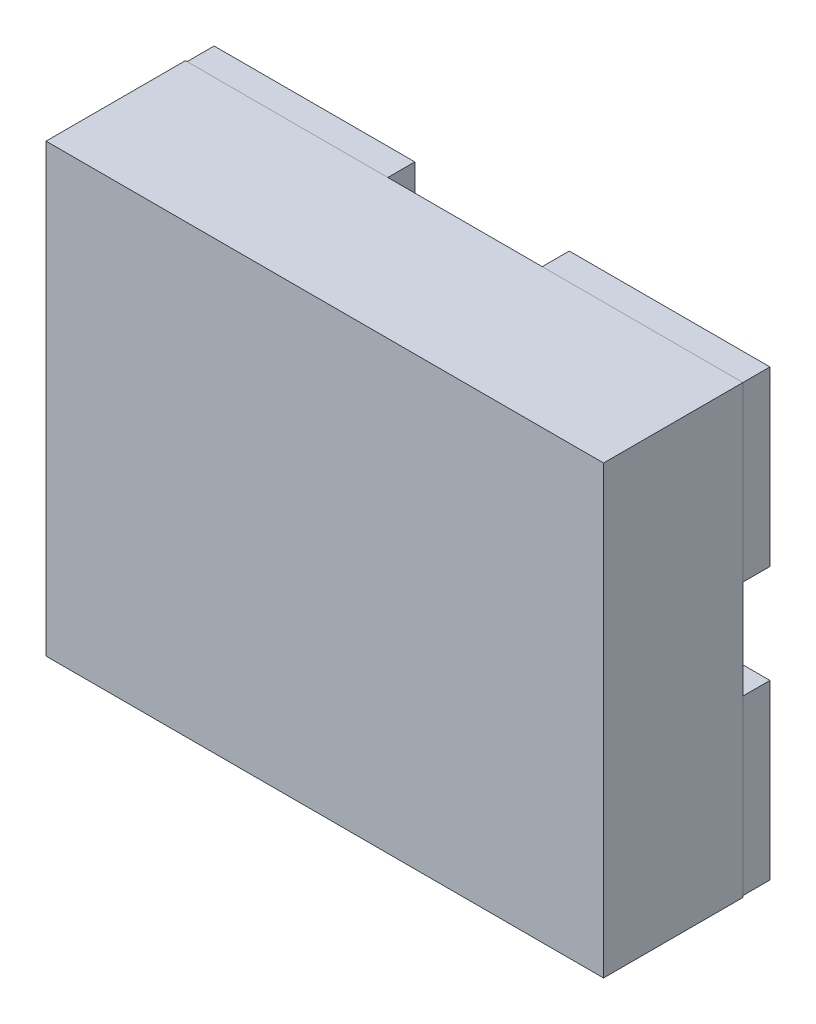
ISO-10303-21;
HEADER;
FILE_DESCRIPTION(('STEP AP214'),'2;1');
FILE_NAME('part.step','',(''),(''),'','','');
FILE_SCHEMA(('AUTOMOTIVE_DESIGN { 1 0 10303 214 1 1 1 1 }'));
ENDSEC;
DATA;
#1=APPLICATION_CONTEXT('core data for automotive mechanical design processes');
#2=APPLICATION_PROTOCOL_DEFINITION('international standard','automotive_design',2000,#1);
#3=PRODUCT_CONTEXT('',#1,'mechanical');
#4=PRODUCT('Part','Part','',(#3));
#5=PRODUCT_RELATED_PRODUCT_CATEGORY('part','',(#4));
#6=PRODUCT_DEFINITION_FORMATION('','',#4);
#7=PRODUCT_DEFINITION_CONTEXT('part definition',#1,'design');
#8=PRODUCT_DEFINITION('design','',#6,#7);
#9=PRODUCT_DEFINITION_SHAPE('','',#8);
#10=(LENGTH_UNIT() NAMED_UNIT(*) SI_UNIT(.MILLI.,.METRE.));
#11=(NAMED_UNIT(*) PLANE_ANGLE_UNIT() SI_UNIT($,.RADIAN.));
#12=(NAMED_UNIT(*) SI_UNIT($,.STERADIAN.) SOLID_ANGLE_UNIT());
#13=UNCERTAINTY_MEASURE_WITH_UNIT(LENGTH_MEASURE(1.E-05),#10,'distance_accuracy_value','');
#14=(GEOMETRIC_REPRESENTATION_CONTEXT(3) GLOBAL_UNCERTAINTY_ASSIGNED_CONTEXT((#13)) GLOBAL_UNIT_ASSIGNED_CONTEXT((#10,
#11,#12)) REPRESENTATION_CONTEXT('',''));
#15=CARTESIAN_POINT('',(0.,0.,0.));
#16=DIRECTION('',(0.,0.,1.));
#17=DIRECTION('',(1.,0.,0.));
#18=AXIS2_PLACEMENT_3D('',#15,#16,#17);
#19=CARTESIAN_POINT('',(0.,0.,0.6));
#20=DIRECTION('',(0.,0.,-1.));
#21=DIRECTION('',(0.,-1.,0.));
#22=AXIS2_PLACEMENT_3D('',#19,#20,#21);
#23=PLANE('',#22);
#24=DIRECTION('',(0.,1.,0.));
#25=VECTOR('',#24,1.);
#26=CARTESIAN_POINT('',(-1.,-0.8,0.6));
#27=LINE('',#26,#25);
#28=CARTESIAN_POINT('',(-1.,-0.8,0.6));
#29=VERTEX_POINT('',#28);
#30=CARTESIAN_POINT('',(-1.,0.8,0.6));
#31=VERTEX_POINT('',#30);
#32=EDGE_CURVE('P0_E21',#29,#31,#27,.T.);
#33=ORIENTED_EDGE('',*,*,#32,.F.);
#34=DIRECTION('',(-1.,0.,0.));
#35=VECTOR('',#34,1.);
#36=CARTESIAN_POINT('',(1.,-0.8,0.6));
#37=LINE('',#36,#35);
#38=CARTESIAN_POINT('',(1.,-0.8,0.6));
#39=VERTEX_POINT('',#38);
#40=EDGE_CURVE('P0_E110',#39,#29,#37,.T.);
#41=ORIENTED_EDGE('',*,*,#40,.F.);
#42=DIRECTION('',(0.,-1.,0.));
#43=VECTOR('',#42,1.);
#44=CARTESIAN_POINT('',(1.,0.8,0.6));
#45=LINE('',#44,#43);
#46=CARTESIAN_POINT('',(1.,0.8,0.6));
#47=VERTEX_POINT('',#46);
#48=EDGE_CURVE('P0_E79',#47,#39,#45,.T.);
#49=ORIENTED_EDGE('',*,*,#48,.F.);
#50=DIRECTION('',(1.,0.,0.));
#51=VECTOR('',#50,1.);
#52=CARTESIAN_POINT('',(-1.,0.8,0.6));
#53=LINE('',#52,#51);
#54=EDGE_CURVE('P0_E77',#31,#47,#53,.T.);
#55=ORIENTED_EDGE('',*,*,#54,.F.);
#56=EDGE_LOOP('',(#33,#41,#49,#55));
#57=FACE_BOUND('',#56,.T.);
#58=ADVANCED_FACE('P0_F17',(#57),#23,.F.);
#59=CARTESIAN_POINT('',(0.,0.,0.1));
#60=DIRECTION('',(0.,0.,-1.));
#61=DIRECTION('',(0.,-1.,0.));
#62=AXIS2_PLACEMENT_3D('',#59,#60,#61);
#63=PLANE('',#62);
#64=DIRECTION('',(1.,0.,0.));
#65=VECTOR('',#64,1.);
#66=CARTESIAN_POINT('',(-1.,0.8,0.1));
#67=LINE('',#66,#65);
#68=CARTESIAN_POINT('',(-1.,0.8,0.1));
#69=VERTEX_POINT('',#68);
#70=CARTESIAN_POINT('',(1.,0.8,0.1));
#71=VERTEX_POINT('',#70);
#72=EDGE_CURVE('P0_E89',#69,#71,#67,.T.);
#73=ORIENTED_EDGE('',*,*,#72,.T.);
#74=DIRECTION('',(0.,-1.,0.));
#75=VECTOR('',#74,1.);
#76=CARTESIAN_POINT('',(1.,0.8,0.1));
#77=LINE('',#76,#75);
#78=CARTESIAN_POINT('',(1.,-0.8,0.1));
#79=VERTEX_POINT('',#78);
#80=EDGE_CURVE('P0_E99',#71,#79,#77,.T.);
#81=ORIENTED_EDGE('',*,*,#80,.T.);
#82=DIRECTION('',(-1.,0.,0.));
#83=VECTOR('',#82,1.);
#84=CARTESIAN_POINT('',(1.,-0.8,0.1));
#85=LINE('',#84,#83);
#86=CARTESIAN_POINT('',(-1.,-0.8,0.1));
#87=VERTEX_POINT('',#86);
#88=EDGE_CURVE('P0_E75',#79,#87,#85,.T.);
#89=ORIENTED_EDGE('',*,*,#88,.T.);
#90=DIRECTION('',(0.,1.,0.));
#91=VECTOR('',#90,1.);
#92=CARTESIAN_POINT('',(-1.,-0.8,0.1));
#93=LINE('',#92,#91);
#94=EDGE_CURVE('P0_E11',#87,#69,#93,.T.);
#95=ORIENTED_EDGE('',*,*,#94,.T.);
#96=EDGE_LOOP('',(#73,#81,#89,#95));
#97=FACE_BOUND('',#96,.T.);
#98=ADVANCED_FACE('P0_F19',(#97),#63,.T.);
#99=CARTESIAN_POINT('',(-1.,-0.8,0.1));
#100=DIRECTION('',(-1.,0.,0.));
#101=DIRECTION('',(0.,0.,1.));
#102=AXIS2_PLACEMENT_3D('',#99,#100,#101);
#103=PLANE('',#102);
#104=DIRECTION('',(0.,0.,1.));
#105=VECTOR('',#104,1.);
#106=CARTESIAN_POINT('',(-1.,-0.8,0.1));
#107=LINE('',#106,#105);
#108=EDGE_CURVE('P0_E72',#87,#29,#107,.T.);
#109=ORIENTED_EDGE('',*,*,#108,.T.);
#110=ORIENTED_EDGE('',*,*,#32,.T.);
#111=DIRECTION('',(0.,0.,1.));
#112=VECTOR('',#111,1.);
#113=CARTESIAN_POINT('',(-1.,0.8,0.1));
#114=LINE('',#113,#112);
#115=EDGE_CURVE('P0_E70',#69,#31,#114,.T.);
#116=ORIENTED_EDGE('',*,*,#115,.F.);
#117=ORIENTED_EDGE('',*,*,#94,.F.);
#118=EDGE_LOOP('',(#109,#110,#116,#117));
#119=FACE_BOUND('',#118,.T.);
#120=ADVANCED_FACE('P0_F68',(#119),#103,.T.);
#121=CARTESIAN_POINT('',(1.,-0.8,0.1));
#122=DIRECTION('',(0.,-1.,0.));
#123=DIRECTION('',(0.,0.,-1.));
#124=AXIS2_PLACEMENT_3D('',#121,#122,#123);
#125=PLANE('',#124);
#126=DIRECTION('',(0.,0.,1.));
#127=VECTOR('',#126,1.);
#128=CARTESIAN_POINT('',(1.,-0.8,0.1));
#129=LINE('',#128,#127);
#130=EDGE_CURVE('P0_E96',#79,#39,#129,.T.);
#131=ORIENTED_EDGE('',*,*,#130,.T.);
#132=ORIENTED_EDGE('',*,*,#40,.T.);
#133=ORIENTED_EDGE('',*,*,#108,.F.);
#134=ORIENTED_EDGE('',*,*,#88,.F.);
#135=EDGE_LOOP('',(#131,#132,#133,#134));
#136=FACE_BOUND('',#135,.T.);
#137=ADVANCED_FACE('P0_F174',(#136),#125,.T.);
#138=CARTESIAN_POINT('',(1.,0.8,0.1));
#139=DIRECTION('',(1.,0.,0.));
#140=DIRECTION('',(0.,1.,0.));
#141=AXIS2_PLACEMENT_3D('',#138,#139,#140);
#142=PLANE('',#141);
#143=DIRECTION('',(0.,0.,1.));
#144=VECTOR('',#143,1.);
#145=CARTESIAN_POINT('',(1.,0.8,0.1));
#146=LINE('',#145,#144);
#147=EDGE_CURVE('P0_E84',#71,#47,#146,.T.);
#148=ORIENTED_EDGE('',*,*,#147,.T.);
#149=ORIENTED_EDGE('',*,*,#48,.T.);
#150=ORIENTED_EDGE('',*,*,#130,.F.);
#151=ORIENTED_EDGE('',*,*,#80,.F.);
#152=EDGE_LOOP('',(#148,#149,#150,#151));
#153=FACE_BOUND('',#152,.T.);
#154=ADVANCED_FACE('P0_F168',(#153),#142,.T.);
#155=CARTESIAN_POINT('',(-1.,0.8,0.1));
#156=DIRECTION('',(0.,1.,0.));
#157=DIRECTION('',(1.,0.,0.));
#158=AXIS2_PLACEMENT_3D('',#155,#156,#157);
#159=PLANE('',#158);
#160=ORIENTED_EDGE('',*,*,#115,.T.);
#161=ORIENTED_EDGE('',*,*,#54,.T.);
#162=ORIENTED_EDGE('',*,*,#147,.F.);
#163=ORIENTED_EDGE('',*,*,#72,.F.);
#164=EDGE_LOOP('',(#160,#161,#162,#163));
#165=FACE_BOUND('',#164,.T.);
#166=ADVANCED_FACE('P0_F87',(#165),#159,.T.);
#167=CLOSED_SHELL('',(#58,#98,#120,#137,#154,#166));
#168=MANIFOLD_SOLID_BREP('P0_B1',#167);
#169=CARTESIAN_POINT('',(-0.997,-0.797,0.1));
#170=DIRECTION('',(0.,0.,1.));
#171=DIRECTION('',(1.,0.,0.));
#172=AXIS2_PLACEMENT_3D('',#169,#170,#171);
#173=PLANE('',#172);
#174=DIRECTION('',(0.,1.,0.));
#175=VECTOR('',#174,1.);
#176=CARTESIAN_POINT('',(-0.997,-0.797,0.1));
#177=LINE('',#176,#175);
#178=CARTESIAN_POINT('',(-0.997,-0.797,0.1));
#179=VERTEX_POINT('',#178);
#180=CARTESIAN_POINT('',(-0.997,-0.177,0.1));
#181=VERTEX_POINT('',#180);
#182=EDGE_CURVE('P1_E72',#179,#181,#177,.T.);
#183=ORIENTED_EDGE('',*,*,#182,.F.);
#184=DIRECTION('',(1.,0.,0.));
#185=VECTOR('',#184,1.);
#186=CARTESIAN_POINT('',(-0.997,-0.797,0.1));
#187=LINE('',#186,#185);
#188=CARTESIAN_POINT('',(-0.277,-0.797,0.1));
#189=VERTEX_POINT('',#188);
#190=EDGE_CURVE('P1_E109',#179,#189,#187,.T.);
#191=ORIENTED_EDGE('',*,*,#190,.T.);
#192=DIRECTION('',(0.,1.,0.));
#193=VECTOR('',#192,1.);
#194=CARTESIAN_POINT('',(-0.277,-0.797,0.1));
#195=LINE('',#194,#193);
#196=CARTESIAN_POINT('',(-0.277,-0.177,0.1));
#197=VERTEX_POINT('',#196);
#198=EDGE_CURVE('P1_E74',#189,#197,#195,.T.);
#199=ORIENTED_EDGE('',*,*,#198,.T.);
#200=DIRECTION('',(1.,0.,0.));
#201=VECTOR('',#200,1.);
#202=CARTESIAN_POINT('',(-0.997,-0.177,0.1));
#203=LINE('',#202,#201);
#204=EDGE_CURVE('P1_E11',#181,#197,#203,.T.);
#205=ORIENTED_EDGE('',*,*,#204,.F.);
#206=EDGE_LOOP('',(#183,#191,#199,#205));
#207=FACE_BOUND('',#206,.T.);
#208=ADVANCED_FACE('P1_F17',(#207),#173,.T.);
#209=CARTESIAN_POINT('',(-0.997,-0.797,0.));
#210=DIRECTION('',(0.,0.,1.));
#211=DIRECTION('',(1.,0.,0.));
#212=AXIS2_PLACEMENT_3D('',#209,#210,#211);
#213=PLANE('',#212);
#214=DIRECTION('',(1.,0.,0.));
#215=VECTOR('',#214,1.);
#216=CARTESIAN_POINT('',(-0.997,-0.177,0.));
#217=LINE('',#216,#215);
#218=CARTESIAN_POINT('',(-0.997,-0.177,0.));
#219=VERTEX_POINT('',#218);
#220=CARTESIAN_POINT('',(-0.277,-0.177,0.));
#221=VERTEX_POINT('',#220);
#222=EDGE_CURVE('P1_E26',#219,#221,#217,.T.);
#223=ORIENTED_EDGE('',*,*,#222,.T.);
#224=DIRECTION('',(0.,1.,0.));
#225=VECTOR('',#224,1.);
#226=CARTESIAN_POINT('',(-0.277,-0.797,0.));
#227=LINE('',#226,#225);
#228=CARTESIAN_POINT('',(-0.277,-0.797,0.));
#229=VERTEX_POINT('',#228);
#230=EDGE_CURVE('P1_E103',#229,#221,#227,.T.);
#231=ORIENTED_EDGE('',*,*,#230,.F.);
#232=DIRECTION('',(1.,0.,0.));
#233=VECTOR('',#232,1.);
#234=CARTESIAN_POINT('',(-0.997,-0.797,0.));
#235=LINE('',#234,#233);
#236=CARTESIAN_POINT('',(-0.997,-0.797,0.));
#237=VERTEX_POINT('',#236);
#238=EDGE_CURVE('P1_E20',#237,#229,#235,.T.);
#239=ORIENTED_EDGE('',*,*,#238,.F.);
#240=DIRECTION('',(0.,1.,0.));
#241=VECTOR('',#240,1.);
#242=CARTESIAN_POINT('',(-0.997,-0.797,0.));
#243=LINE('',#242,#241);
#244=EDGE_CURVE('P1_E82',#237,#219,#243,.T.);
#245=ORIENTED_EDGE('',*,*,#244,.T.);
#246=EDGE_LOOP('',(#223,#231,#239,#245));
#247=FACE_BOUND('',#246,.T.);
#248=ADVANCED_FACE('P1_F118',(#247),#213,.F.);
#249=CARTESIAN_POINT('',(-0.997,-0.177,0.));
#250=DIRECTION('',(0.,1.,0.));
#251=DIRECTION('',(1.,0.,0.));
#252=AXIS2_PLACEMENT_3D('',#249,#250,#251);
#253=PLANE('',#252);
#254=ORIENTED_EDGE('',*,*,#222,.F.);
#255=DIRECTION('',(0.,0.,1.));
#256=VECTOR('',#255,1.);
#257=CARTESIAN_POINT('',(-0.997,-0.177,0.));
#258=LINE('',#257,#256);
#259=EDGE_CURVE('P1_E77',#219,#181,#258,.T.);
#260=ORIENTED_EDGE('',*,*,#259,.T.);
#261=ORIENTED_EDGE('',*,*,#204,.T.);
#262=DIRECTION('',(0.,0.,1.));
#263=VECTOR('',#262,1.);
#264=CARTESIAN_POINT('',(-0.277,-0.177,0.));
#265=LINE('',#264,#263);
#266=EDGE_CURVE('P1_E107',#221,#197,#265,.T.);
#267=ORIENTED_EDGE('',*,*,#266,.F.);
#268=EDGE_LOOP('',(#254,#260,#261,#267));
#269=FACE_BOUND('',#268,.T.);
#270=ADVANCED_FACE('P1_F78',(#269),#253,.T.);
#271=CARTESIAN_POINT('',(-0.997,-0.797,0.));
#272=DIRECTION('',(0.,1.,0.));
#273=DIRECTION('',(1.,0.,0.));
#274=AXIS2_PLACEMENT_3D('',#271,#272,#273);
#275=PLANE('',#274);
#276=DIRECTION('',(0.,0.,1.));
#277=VECTOR('',#276,1.);
#278=CARTESIAN_POINT('',(-0.277,-0.797,0.));
#279=LINE('',#278,#277);
#280=EDGE_CURVE('P1_E99',#229,#189,#279,.T.);
#281=ORIENTED_EDGE('',*,*,#280,.T.);
#282=ORIENTED_EDGE('',*,*,#190,.F.);
#283=DIRECTION('',(0.,0.,1.));
#284=VECTOR('',#283,1.);
#285=CARTESIAN_POINT('',(-0.997,-0.797,0.));
#286=LINE('',#285,#284);
#287=EDGE_CURVE('P1_E87',#237,#179,#286,.T.);
#288=ORIENTED_EDGE('',*,*,#287,.F.);
#289=ORIENTED_EDGE('',*,*,#238,.T.);
#290=EDGE_LOOP('',(#281,#282,#288,#289));
#291=FACE_BOUND('',#290,.T.);
#292=ADVANCED_FACE('P1_F116',(#291),#275,.F.);
#293=CARTESIAN_POINT('',(-0.277,-0.797,0.));
#294=DIRECTION('',(1.,0.,0.));
#295=DIRECTION('',(0.,1.,0.));
#296=AXIS2_PLACEMENT_3D('',#293,#294,#295);
#297=PLANE('',#296);
#298=ORIENTED_EDGE('',*,*,#280,.F.);
#299=ORIENTED_EDGE('',*,*,#230,.T.);
#300=ORIENTED_EDGE('',*,*,#266,.T.);
#301=ORIENTED_EDGE('',*,*,#198,.F.);
#302=EDGE_LOOP('',(#298,#299,#300,#301));
#303=FACE_BOUND('',#302,.T.);
#304=ADVANCED_FACE('P1_F120',(#303),#297,.T.);
#305=CARTESIAN_POINT('',(-0.997,-0.797,0.));
#306=DIRECTION('',(1.,0.,0.));
#307=DIRECTION('',(0.,1.,0.));
#308=AXIS2_PLACEMENT_3D('',#305,#306,#307);
#309=PLANE('',#308);
#310=ORIENTED_EDGE('',*,*,#182,.T.);
#311=ORIENTED_EDGE('',*,*,#259,.F.);
#312=ORIENTED_EDGE('',*,*,#244,.F.);
#313=ORIENTED_EDGE('',*,*,#287,.T.);
#314=EDGE_LOOP('',(#310,#311,#312,#313));
#315=FACE_BOUND('',#314,.T.);
#316=ADVANCED_FACE('P1_F85',(#315),#309,.F.);
#317=CLOSED_SHELL('',(#208,#248,#270,#292,#304,#316));
#318=MANIFOLD_SOLID_BREP('P1_B1',#317);
#319=CARTESIAN_POINT('',(0.277,-0.797,0.1));
#320=DIRECTION('',(0.,0.,1.));
#321=DIRECTION('',(1.,0.,0.));
#322=AXIS2_PLACEMENT_3D('',#319,#320,#321);
#323=PLANE('',#322);
#324=DIRECTION('',(0.,1.,0.));
#325=VECTOR('',#324,1.);
#326=CARTESIAN_POINT('',(0.277,-0.797,0.1));
#327=LINE('',#326,#325);
#328=CARTESIAN_POINT('',(0.277,-0.797,0.1));
#329=VERTEX_POINT('',#328);
#330=CARTESIAN_POINT('',(0.277,-0.177,0.1));
#331=VERTEX_POINT('',#330);
#332=EDGE_CURVE('P2_E83',#329,#331,#327,.T.);
#333=ORIENTED_EDGE('',*,*,#332,.F.);
#334=DIRECTION('',(1.,0.,0.));
#335=VECTOR('',#334,1.);
#336=CARTESIAN_POINT('',(0.277,-0.797,0.1));
#337=LINE('',#336,#335);
#338=CARTESIAN_POINT('',(0.997,-0.797,0.1));
#339=VERTEX_POINT('',#338);
#340=EDGE_CURVE('P2_E66',#329,#339,#337,.T.);
#341=ORIENTED_EDGE('',*,*,#340,.T.);
#342=DIRECTION('',(0.,1.,0.));
#343=VECTOR('',#342,1.);
#344=CARTESIAN_POINT('',(0.997,-0.797,0.1));
#345=LINE('',#344,#343);
#346=CARTESIAN_POINT('',(0.997,-0.177,0.1));
#347=VERTEX_POINT('',#346);
#348=EDGE_CURVE('P2_E78',#339,#347,#345,.T.);
#349=ORIENTED_EDGE('',*,*,#348,.T.);
#350=DIRECTION('',(1.,0.,0.));
#351=VECTOR('',#350,1.);
#352=CARTESIAN_POINT('',(0.277,-0.177,0.1));
#353=LINE('',#352,#351);
#354=EDGE_CURVE('P2_E11',#331,#347,#353,.T.);
#355=ORIENTED_EDGE('',*,*,#354,.F.);
#356=EDGE_LOOP('',(#333,#341,#349,#355));
#357=FACE_BOUND('',#356,.T.);
#358=ADVANCED_FACE('P2_F17',(#357),#323,.T.);
#359=CARTESIAN_POINT('',(0.277,-0.797,0.));
#360=DIRECTION('',(0.,0.,1.));
#361=DIRECTION('',(1.,0.,0.));
#362=AXIS2_PLACEMENT_3D('',#359,#360,#361);
#363=PLANE('',#362);
#364=DIRECTION('',(1.,0.,0.));
#365=VECTOR('',#364,1.);
#366=CARTESIAN_POINT('',(0.277,-0.177,0.));
#367=LINE('',#366,#365);
#368=CARTESIAN_POINT('',(0.277,-0.177,0.));
#369=VERTEX_POINT('',#368);
#370=CARTESIAN_POINT('',(0.997,-0.177,0.));
#371=VERTEX_POINT('',#370);
#372=EDGE_CURVE('P2_E27',#369,#371,#367,.T.);
#373=ORIENTED_EDGE('',*,*,#372,.T.);
#374=DIRECTION('',(0.,1.,0.));
#375=VECTOR('',#374,1.);
#376=CARTESIAN_POINT('',(0.997,-0.797,0.));
#377=LINE('',#376,#375);
#378=CARTESIAN_POINT('',(0.997,-0.797,0.));
#379=VERTEX_POINT('',#378);
#380=EDGE_CURVE('P2_E101',#379,#371,#377,.T.);
#381=ORIENTED_EDGE('',*,*,#380,.F.);
#382=DIRECTION('',(1.,0.,0.));
#383=VECTOR('',#382,1.);
#384=CARTESIAN_POINT('',(0.277,-0.797,0.));
#385=LINE('',#384,#383);
#386=CARTESIAN_POINT('',(0.277,-0.797,0.));
#387=VERTEX_POINT('',#386);
#388=EDGE_CURVE('P2_E77',#387,#379,#385,.T.);
#389=ORIENTED_EDGE('',*,*,#388,.F.);
#390=DIRECTION('',(0.,1.,0.));
#391=VECTOR('',#390,1.);
#392=CARTESIAN_POINT('',(0.277,-0.797,0.));
#393=LINE('',#392,#391);
#394=EDGE_CURVE('P2_E85',#387,#369,#393,.T.);
#395=ORIENTED_EDGE('',*,*,#394,.T.);
#396=EDGE_LOOP('',(#373,#381,#389,#395));
#397=FACE_BOUND('',#396,.T.);
#398=ADVANCED_FACE('P2_F19',(#397),#363,.F.);
#399=CARTESIAN_POINT('',(0.277,-0.177,0.));
#400=DIRECTION('',(0.,1.,0.));
#401=DIRECTION('',(1.,0.,0.));
#402=AXIS2_PLACEMENT_3D('',#399,#400,#401);
#403=PLANE('',#402);
#404=ORIENTED_EDGE('',*,*,#372,.F.);
#405=DIRECTION('',(0.,0.,1.));
#406=VECTOR('',#405,1.);
#407=CARTESIAN_POINT('',(0.277,-0.177,0.));
#408=LINE('',#407,#406);
#409=EDGE_CURVE('P2_E89',#369,#331,#408,.T.);
#410=ORIENTED_EDGE('',*,*,#409,.T.);
#411=ORIENTED_EDGE('',*,*,#354,.T.);
#412=DIRECTION('',(0.,0.,1.));
#413=VECTOR('',#412,1.);
#414=CARTESIAN_POINT('',(0.997,-0.177,0.));
#415=LINE('',#414,#413);
#416=EDGE_CURVE('P2_E105',#371,#347,#415,.T.);
#417=ORIENTED_EDGE('',*,*,#416,.F.);
#418=EDGE_LOOP('',(#404,#410,#411,#417));
#419=FACE_BOUND('',#418,.T.);
#420=ADVANCED_FACE('P2_F120',(#419),#403,.T.);
#421=CARTESIAN_POINT('',(0.277,-0.797,0.));
#422=DIRECTION('',(0.,1.,0.));
#423=DIRECTION('',(1.,0.,0.));
#424=AXIS2_PLACEMENT_3D('',#421,#422,#423);
#425=PLANE('',#424);
#426=DIRECTION('',(0.,0.,1.));
#427=VECTOR('',#426,1.);
#428=CARTESIAN_POINT('',(0.997,-0.797,0.));
#429=LINE('',#428,#427);
#430=EDGE_CURVE('P2_E72',#379,#339,#429,.T.);
#431=ORIENTED_EDGE('',*,*,#430,.T.);
#432=ORIENTED_EDGE('',*,*,#340,.F.);
#433=DIRECTION('',(0.,0.,1.));
#434=VECTOR('',#433,1.);
#435=CARTESIAN_POINT('',(0.277,-0.797,0.));
#436=LINE('',#435,#434);
#437=EDGE_CURVE('P2_E69',#387,#329,#436,.T.);
#438=ORIENTED_EDGE('',*,*,#437,.F.);
#439=ORIENTED_EDGE('',*,*,#388,.T.);
#440=EDGE_LOOP('',(#431,#432,#438,#439));
#441=FACE_BOUND('',#440,.T.);
#442=ADVANCED_FACE('P2_F68',(#441),#425,.F.);
#443=CARTESIAN_POINT('',(0.997,-0.797,0.));
#444=DIRECTION('',(1.,0.,0.));
#445=DIRECTION('',(0.,1.,0.));
#446=AXIS2_PLACEMENT_3D('',#443,#444,#445);
#447=PLANE('',#446);
#448=ORIENTED_EDGE('',*,*,#430,.F.);
#449=ORIENTED_EDGE('',*,*,#380,.T.);
#450=ORIENTED_EDGE('',*,*,#416,.T.);
#451=ORIENTED_EDGE('',*,*,#348,.F.);
#452=EDGE_LOOP('',(#448,#449,#450,#451));
#453=FACE_BOUND('',#452,.T.);
#454=ADVANCED_FACE('P2_F116',(#453),#447,.T.);
#455=CARTESIAN_POINT('',(0.277,-0.797,0.));
#456=DIRECTION('',(1.,0.,0.));
#457=DIRECTION('',(0.,1.,0.));
#458=AXIS2_PLACEMENT_3D('',#455,#456,#457);
#459=PLANE('',#458);
#460=ORIENTED_EDGE('',*,*,#332,.T.);
#461=ORIENTED_EDGE('',*,*,#409,.F.);
#462=ORIENTED_EDGE('',*,*,#394,.F.);
#463=ORIENTED_EDGE('',*,*,#437,.T.);
#464=EDGE_LOOP('',(#460,#461,#462,#463));
#465=FACE_BOUND('',#464,.T.);
#466=ADVANCED_FACE('P2_F81',(#465),#459,.F.);
#467=CLOSED_SHELL('',(#358,#398,#420,#442,#454,#466));
#468=MANIFOLD_SOLID_BREP('P2_B1',#467);
#469=CARTESIAN_POINT('',(0.277,0.177,0.1));
#470=DIRECTION('',(0.,0.,1.));
#471=DIRECTION('',(1.,0.,0.));
#472=AXIS2_PLACEMENT_3D('',#469,#470,#471);
#473=PLANE('',#472);
#474=DIRECTION('',(0.,1.,0.));
#475=VECTOR('',#474,1.);
#476=CARTESIAN_POINT('',(0.277,0.177,0.1));
#477=LINE('',#476,#475);
#478=CARTESIAN_POINT('',(0.277,0.177,0.1));
#479=VERTEX_POINT('',#478);
#480=CARTESIAN_POINT('',(0.277,0.797,0.1));
#481=VERTEX_POINT('',#480);
#482=EDGE_CURVE('P3_E91',#479,#481,#477,.T.);
#483=ORIENTED_EDGE('',*,*,#482,.F.);
#484=DIRECTION('',(1.,0.,0.));
#485=VECTOR('',#484,1.);
#486=CARTESIAN_POINT('',(0.277,0.177,0.1));
#487=LINE('',#486,#485);
#488=CARTESIAN_POINT('',(0.997,0.177,0.1));
#489=VERTEX_POINT('',#488);
#490=EDGE_CURVE('P3_E74',#479,#489,#487,.T.);
#491=ORIENTED_EDGE('',*,*,#490,.T.);
#492=DIRECTION('',(0.,1.,0.));
#493=VECTOR('',#492,1.);
#494=CARTESIAN_POINT('',(0.997,0.177,0.1));
#495=LINE('',#494,#493);
#496=CARTESIAN_POINT('',(0.997,0.797,0.1));
#497=VERTEX_POINT('',#496);
#498=EDGE_CURVE('P3_E85',#489,#497,#495,.T.);
#499=ORIENTED_EDGE('',*,*,#498,.T.);
#500=DIRECTION('',(1.,0.,0.));
#501=VECTOR('',#500,1.);
#502=CARTESIAN_POINT('',(0.277,0.797,0.1));
#503=LINE('',#502,#501);
#504=EDGE_CURVE('P3_E11',#481,#497,#503,.T.);
#505=ORIENTED_EDGE('',*,*,#504,.F.);
#506=EDGE_LOOP('',(#483,#491,#499,#505));
#507=FACE_BOUND('',#506,.T.);
#508=ADVANCED_FACE('P3_F17',(#507),#473,.T.);
#509=CARTESIAN_POINT('',(0.277,0.177,0.));
#510=DIRECTION('',(0.,0.,1.));
#511=DIRECTION('',(1.,0.,0.));
#512=AXIS2_PLACEMENT_3D('',#509,#510,#511);
#513=PLANE('',#512);
#514=DIRECTION('',(1.,0.,0.));
#515=VECTOR('',#514,1.);
#516=CARTESIAN_POINT('',(0.277,0.797,0.));
#517=LINE('',#516,#515);
#518=CARTESIAN_POINT('',(0.277,0.797,0.));
#519=VERTEX_POINT('',#518);
#520=CARTESIAN_POINT('',(0.997,0.797,0.));
#521=VERTEX_POINT('',#520);
#522=EDGE_CURVE('P3_E25',#519,#521,#517,.T.);
#523=ORIENTED_EDGE('',*,*,#522,.T.);
#524=DIRECTION('',(0.,1.,0.));
#525=VECTOR('',#524,1.);
#526=CARTESIAN_POINT('',(0.997,0.177,0.));
#527=LINE('',#526,#525);
#528=CARTESIAN_POINT('',(0.997,0.177,0.));
#529=VERTEX_POINT('',#528);
#530=EDGE_CURVE('P3_E106',#529,#521,#527,.T.);
#531=ORIENTED_EDGE('',*,*,#530,.F.);
#532=DIRECTION('',(1.,0.,0.));
#533=VECTOR('',#532,1.);
#534=CARTESIAN_POINT('',(0.277,0.177,0.));
#535=LINE('',#534,#533);
#536=CARTESIAN_POINT('',(0.277,0.177,0.));
#537=VERTEX_POINT('',#536);
#538=EDGE_CURVE('P3_E60',#537,#529,#535,.T.);
#539=ORIENTED_EDGE('',*,*,#538,.F.);
#540=DIRECTION('',(0.,1.,0.));
#541=VECTOR('',#540,1.);
#542=CARTESIAN_POINT('',(0.277,0.177,0.));
#543=LINE('',#542,#541);
#544=EDGE_CURVE('P3_E92',#537,#519,#543,.T.);
#545=ORIENTED_EDGE('',*,*,#544,.T.);
#546=EDGE_LOOP('',(#523,#531,#539,#545));
#547=FACE_BOUND('',#546,.T.);
#548=ADVANCED_FACE('P3_F150',(#547),#513,.F.);
#549=CARTESIAN_POINT('',(0.277,0.797,0.));
#550=DIRECTION('',(0.,1.,0.));
#551=DIRECTION('',(1.,0.,0.));
#552=AXIS2_PLACEMENT_3D('',#549,#550,#551);
#553=PLANE('',#552);
#554=ORIENTED_EDGE('',*,*,#522,.F.);
#555=DIRECTION('',(0.,0.,1.));
#556=VECTOR('',#555,1.);
#557=CARTESIAN_POINT('',(0.277,0.797,0.));
#558=LINE('',#557,#556);
#559=EDGE_CURVE('P3_E96',#519,#481,#558,.T.);
#560=ORIENTED_EDGE('',*,*,#559,.T.);
#561=ORIENTED_EDGE('',*,*,#504,.T.);
#562=DIRECTION('',(0.,0.,1.));
#563=VECTOR('',#562,1.);
#564=CARTESIAN_POINT('',(0.997,0.797,0.));
#565=LINE('',#564,#563);
#566=EDGE_CURVE('P3_E110',#521,#497,#565,.T.);
#567=ORIENTED_EDGE('',*,*,#566,.F.);
#568=EDGE_LOOP('',(#554,#560,#561,#567));
#569=FACE_BOUND('',#568,.T.);
#570=ADVANCED_FACE('P3_F143',(#569),#553,.T.);
#571=CARTESIAN_POINT('',(0.277,0.177,0.));
#572=DIRECTION('',(0.,1.,0.));
#573=DIRECTION('',(1.,0.,0.));
#574=AXIS2_PLACEMENT_3D('',#571,#572,#573);
#575=PLANE('',#574);
#576=DIRECTION('',(0.,0.,1.));
#577=VECTOR('',#576,1.);
#578=CARTESIAN_POINT('',(0.997,0.177,0.));
#579=LINE('',#578,#577);
#580=EDGE_CURVE('P3_E80',#529,#489,#579,.T.);
#581=ORIENTED_EDGE('',*,*,#580,.T.);
#582=ORIENTED_EDGE('',*,*,#490,.F.);
#583=DIRECTION('',(0.,0.,1.));
#584=VECTOR('',#583,1.);
#585=CARTESIAN_POINT('',(0.277,0.177,0.));
#586=LINE('',#585,#584);
#587=EDGE_CURVE('P3_E77',#537,#479,#586,.T.);
#588=ORIENTED_EDGE('',*,*,#587,.F.);
#589=ORIENTED_EDGE('',*,*,#538,.T.);
#590=EDGE_LOOP('',(#581,#582,#588,#589));
#591=FACE_BOUND('',#590,.T.);
#592=ADVANCED_FACE('P3_F76',(#591),#575,.F.);
#593=CARTESIAN_POINT('',(0.997,0.177,0.));
#594=DIRECTION('',(1.,0.,0.));
#595=DIRECTION('',(0.,1.,0.));
#596=AXIS2_PLACEMENT_3D('',#593,#594,#595);
#597=PLANE('',#596);
#598=ORIENTED_EDGE('',*,*,#580,.F.);
#599=ORIENTED_EDGE('',*,*,#530,.T.);
#600=ORIENTED_EDGE('',*,*,#566,.T.);
#601=ORIENTED_EDGE('',*,*,#498,.F.);
#602=EDGE_LOOP('',(#598,#599,#600,#601));
#603=FACE_BOUND('',#602,.T.);
#604=ADVANCED_FACE('P3_F128',(#603),#597,.T.);
#605=CARTESIAN_POINT('',(0.277,0.177,0.));
#606=DIRECTION('',(1.,0.,0.));
#607=DIRECTION('',(0.,1.,0.));
#608=AXIS2_PLACEMENT_3D('',#605,#606,#607);
#609=PLANE('',#608);
#610=ORIENTED_EDGE('',*,*,#482,.T.);
#611=ORIENTED_EDGE('',*,*,#559,.F.);
#612=ORIENTED_EDGE('',*,*,#544,.F.);
#613=ORIENTED_EDGE('',*,*,#587,.T.);
#614=EDGE_LOOP('',(#610,#611,#612,#613));
#615=FACE_BOUND('',#614,.T.);
#616=ADVANCED_FACE('P3_F89',(#615),#609,.F.);
#617=CLOSED_SHELL('',(#508,#548,#570,#592,#604,#616));
#618=MANIFOLD_SOLID_BREP('P3_B1',#617);
#619=CARTESIAN_POINT('',(-0.997,0.177,0.1));
#620=DIRECTION('',(0.,0.,1.));
#621=DIRECTION('',(1.,0.,0.));
#622=AXIS2_PLACEMENT_3D('',#619,#620,#621);
#623=PLANE('',#622);
#624=DIRECTION('',(0.,1.,0.));
#625=VECTOR('',#624,1.);
#626=CARTESIAN_POINT('',(-0.997,0.177,0.1));
#627=LINE('',#626,#625);
#628=CARTESIAN_POINT('',(-0.997,0.177,0.1));
#629=VERTEX_POINT('',#628);
#630=CARTESIAN_POINT('',(-0.997,0.797,0.1));
#631=VERTEX_POINT('',#630);
#632=EDGE_CURVE('P4_E89',#629,#631,#627,.T.);
#633=ORIENTED_EDGE('',*,*,#632,.F.);
#634=DIRECTION('',(1.,0.,0.));
#635=VECTOR('',#634,1.);
#636=CARTESIAN_POINT('',(-0.997,0.177,0.1));
#637=LINE('',#636,#635);
#638=CARTESIAN_POINT('',(-0.277,0.177,0.1));
#639=VERTEX_POINT('',#638);
#640=EDGE_CURVE('P4_E71',#629,#639,#637,.T.);
#641=ORIENTED_EDGE('',*,*,#640,.T.);
#642=DIRECTION('',(0.,1.,0.));
#643=VECTOR('',#642,1.);
#644=CARTESIAN_POINT('',(-0.277,0.177,0.1));
#645=LINE('',#644,#643);
#646=CARTESIAN_POINT('',(-0.277,0.797,0.1));
#647=VERTEX_POINT('',#646);
#648=EDGE_CURVE('P4_E83',#639,#647,#645,.T.);
#649=ORIENTED_EDGE('',*,*,#648,.T.);
#650=DIRECTION('',(1.,0.,0.));
#651=VECTOR('',#650,1.);
#652=CARTESIAN_POINT('',(-0.997,0.797,0.1));
#653=LINE('',#652,#651);
#654=EDGE_CURVE('P4_E11',#631,#647,#653,.T.);
#655=ORIENTED_EDGE('',*,*,#654,.F.);
#656=EDGE_LOOP('',(#633,#641,#649,#655));
#657=FACE_BOUND('',#656,.T.);
#658=ADVANCED_FACE('P4_F17',(#657),#623,.T.);
#659=CARTESIAN_POINT('',(-0.997,0.177,0.));
#660=DIRECTION('',(0.,0.,1.));
#661=DIRECTION('',(1.,0.,0.));
#662=AXIS2_PLACEMENT_3D('',#659,#660,#661);
#663=PLANE('',#662);
#664=DIRECTION('',(1.,0.,0.));
#665=VECTOR('',#664,1.);
#666=CARTESIAN_POINT('',(-0.997,0.797,0.));
#667=LINE('',#666,#665);
#668=CARTESIAN_POINT('',(-0.997,0.797,0.));
#669=VERTEX_POINT('',#668);
#670=CARTESIAN_POINT('',(-0.277,0.797,0.));
#671=VERTEX_POINT('',#670);
#672=EDGE_CURVE('P4_E26',#669,#671,#667,.T.);
#673=ORIENTED_EDGE('',*,*,#672,.T.);
#674=DIRECTION('',(0.,1.,0.));
#675=VECTOR('',#674,1.);
#676=CARTESIAN_POINT('',(-0.277,0.177,0.));
#677=LINE('',#676,#675);
#678=CARTESIAN_POINT('',(-0.277,0.177,0.));
#679=VERTEX_POINT('',#678);
#680=EDGE_CURVE('P4_E107',#679,#671,#677,.T.);
#681=ORIENTED_EDGE('',*,*,#680,.F.);
#682=DIRECTION('',(1.,0.,0.));
#683=VECTOR('',#682,1.);
#684=CARTESIAN_POINT('',(-0.997,0.177,0.));
#685=LINE('',#684,#683);
#686=CARTESIAN_POINT('',(-0.997,0.177,0.));
#687=VERTEX_POINT('',#686);
#688=EDGE_CURVE('P4_E82',#687,#679,#685,.T.);
#689=ORIENTED_EDGE('',*,*,#688,.F.);
#690=DIRECTION('',(0.,1.,0.));
#691=VECTOR('',#690,1.);
#692=CARTESIAN_POINT('',(-0.997,0.177,0.));
#693=LINE('',#692,#691);
#694=EDGE_CURVE('P4_E90',#687,#669,#693,.T.);
#695=ORIENTED_EDGE('',*,*,#694,.T.);
#696=EDGE_LOOP('',(#673,#681,#689,#695));
#697=FACE_BOUND('',#696,.T.);
#698=ADVANCED_FACE('P4_F19',(#697),#663,.F.);
#699=CARTESIAN_POINT('',(-0.997,0.797,0.));
#700=DIRECTION('',(0.,1.,0.));
#701=DIRECTION('',(1.,0.,0.));
#702=AXIS2_PLACEMENT_3D('',#699,#700,#701);
#703=PLANE('',#702);
#704=ORIENTED_EDGE('',*,*,#672,.F.);
#705=DIRECTION('',(0.,0.,1.));
#706=VECTOR('',#705,1.);
#707=CARTESIAN_POINT('',(-0.997,0.797,0.));
#708=LINE('',#707,#706);
#709=EDGE_CURVE('P4_E94',#669,#631,#708,.T.);
#710=ORIENTED_EDGE('',*,*,#709,.T.);
#711=ORIENTED_EDGE('',*,*,#654,.T.);
#712=DIRECTION('',(0.,0.,1.));
#713=VECTOR('',#712,1.);
#714=CARTESIAN_POINT('',(-0.277,0.797,0.));
#715=LINE('',#714,#713);
#716=EDGE_CURVE('P4_E104',#671,#647,#715,.T.);
#717=ORIENTED_EDGE('',*,*,#716,.F.);
#718=EDGE_LOOP('',(#704,#710,#711,#717));
#719=FACE_BOUND('',#718,.T.);
#720=ADVANCED_FACE('P4_F119',(#719),#703,.T.);
#721=CARTESIAN_POINT('',(-0.997,0.177,0.));
#722=DIRECTION('',(0.,1.,0.));
#723=DIRECTION('',(1.,0.,0.));
#724=AXIS2_PLACEMENT_3D('',#721,#722,#723);
#725=PLANE('',#724);
#726=DIRECTION('',(0.,0.,1.));
#727=VECTOR('',#726,1.);
#728=CARTESIAN_POINT('',(-0.277,0.177,0.));
#729=LINE('',#728,#727);
#730=EDGE_CURVE('P4_E77',#679,#639,#729,.T.);
#731=ORIENTED_EDGE('',*,*,#730,.T.);
#732=ORIENTED_EDGE('',*,*,#640,.F.);
#733=DIRECTION('',(0.,0.,1.));
#734=VECTOR('',#733,1.);
#735=CARTESIAN_POINT('',(-0.997,0.177,0.));
#736=LINE('',#735,#734);
#737=EDGE_CURVE('P4_E74',#687,#629,#736,.T.);
#738=ORIENTED_EDGE('',*,*,#737,.F.);
#739=ORIENTED_EDGE('',*,*,#688,.T.);
#740=EDGE_LOOP('',(#731,#732,#738,#739));
#741=FACE_BOUND('',#740,.T.);
#742=ADVANCED_FACE('P4_F73',(#741),#725,.F.);
#743=CARTESIAN_POINT('',(-0.277,0.177,0.));
#744=DIRECTION('',(1.,0.,0.));
#745=DIRECTION('',(0.,1.,0.));
#746=AXIS2_PLACEMENT_3D('',#743,#744,#745);
#747=PLANE('',#746);
#748=ORIENTED_EDGE('',*,*,#730,.F.);
#749=ORIENTED_EDGE('',*,*,#680,.T.);
#750=ORIENTED_EDGE('',*,*,#716,.T.);
#751=ORIENTED_EDGE('',*,*,#648,.F.);
#752=EDGE_LOOP('',(#748,#749,#750,#751));
#753=FACE_BOUND('',#752,.T.);
#754=ADVANCED_FACE('P4_F118',(#753),#747,.T.);
#755=CARTESIAN_POINT('',(-0.997,0.177,0.));
#756=DIRECTION('',(1.,0.,0.));
#757=DIRECTION('',(0.,1.,0.));
#758=AXIS2_PLACEMENT_3D('',#755,#756,#757);
#759=PLANE('',#758);
#760=ORIENTED_EDGE('',*,*,#632,.T.);
#761=ORIENTED_EDGE('',*,*,#709,.F.);
#762=ORIENTED_EDGE('',*,*,#694,.F.);
#763=ORIENTED_EDGE('',*,*,#737,.T.);
#764=EDGE_LOOP('',(#760,#761,#762,#763));
#765=FACE_BOUND('',#764,.T.);
#766=ADVANCED_FACE('P4_F87',(#765),#759,.F.);
#767=CLOSED_SHELL('',(#658,#698,#720,#742,#754,#766));
#768=MANIFOLD_SOLID_BREP('P4_B1',#767);
#769=ADVANCED_BREP_SHAPE_REPRESENTATION('',(#18,#168,#318,#468,#618,#768),#14);
#770=SHAPE_DEFINITION_REPRESENTATION(#9,#769);
ENDSEC;
END-ISO-10303-21;
